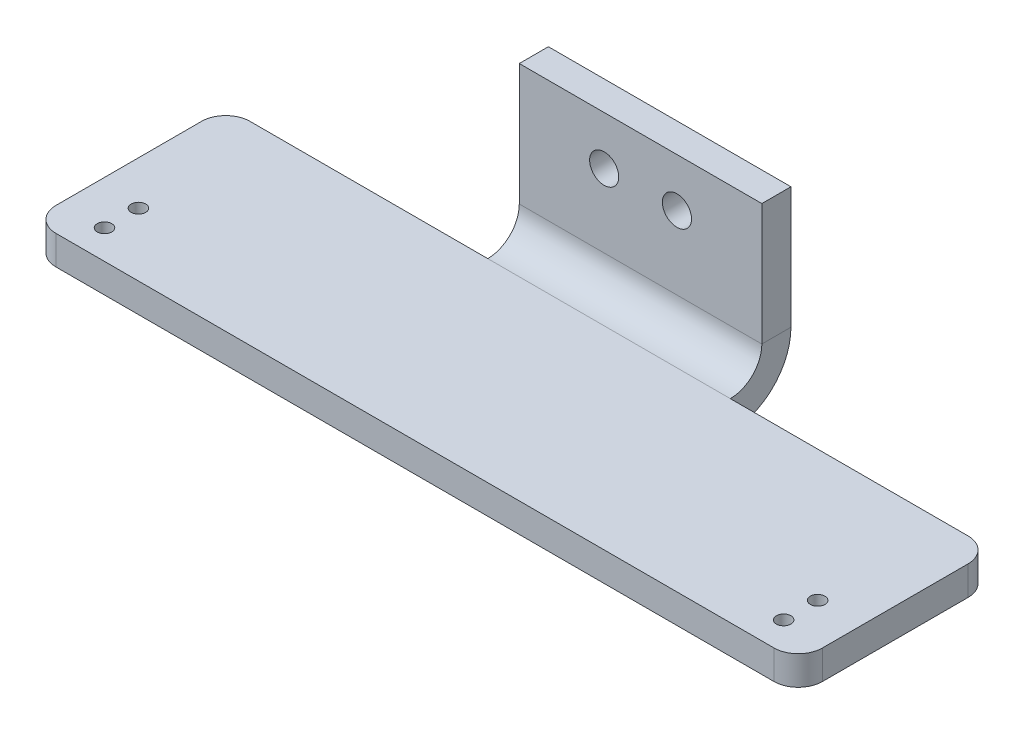
ISO-10303-21;
HEADER;
FILE_DESCRIPTION(('STEP AP214'),'2;1');
FILE_NAME('part.step','',(''),(''),'','','');
FILE_SCHEMA(('AUTOMOTIVE_DESIGN { 1 0 10303 214 1 1 1 1 }'));
ENDSEC;
DATA;
#1=APPLICATION_CONTEXT('core data for automotive mechanical design processes');
#2=APPLICATION_PROTOCOL_DEFINITION('international standard','automotive_design',2000,#1);
#3=PRODUCT_CONTEXT('',#1,'mechanical');
#4=PRODUCT('Part','Part','',(#3));
#5=PRODUCT_RELATED_PRODUCT_CATEGORY('part','',(#4));
#6=PRODUCT_DEFINITION_FORMATION('','',#4);
#7=PRODUCT_DEFINITION_CONTEXT('part definition',#1,'design');
#8=PRODUCT_DEFINITION('design','',#6,#7);
#9=PRODUCT_DEFINITION_SHAPE('','',#8);
#10=(LENGTH_UNIT() NAMED_UNIT(*) SI_UNIT(.MILLI.,.METRE.));
#11=(NAMED_UNIT(*) PLANE_ANGLE_UNIT() SI_UNIT($,.RADIAN.));
#12=(NAMED_UNIT(*) SI_UNIT($,.STERADIAN.) SOLID_ANGLE_UNIT());
#13=UNCERTAINTY_MEASURE_WITH_UNIT(LENGTH_MEASURE(1.E-05),#10,'distance_accuracy_value','');
#14=(GEOMETRIC_REPRESENTATION_CONTEXT(3) GLOBAL_UNCERTAINTY_ASSIGNED_CONTEXT((#13)) GLOBAL_UNIT_ASSIGNED_CONTEXT((#10,
#11,#12)) REPRESENTATION_CONTEXT('',''));
#15=CARTESIAN_POINT('',(0.,0.,0.));
#16=DIRECTION('',(0.,0.,1.));
#17=DIRECTION('',(1.,0.,0.));
#18=AXIS2_PLACEMENT_3D('',#15,#16,#17);
#19=CARTESIAN_POINT('',(0.,-28.4225651045515,-32.5000000000001));
#20=DIRECTION('',(0.,0.,1.));
#21=DIRECTION('',(0.,-1.,0.));
#22=AXIS2_PLACEMENT_3D('',#19,#20,#21);
#23=PLANE('',#22);
#24=CARTESIAN_POINT('',(-7.5,21.5774348954485,-32.5));
#25=DIRECTION('',(0.,0.,1.));
#26=DIRECTION('',(1.,0.,0.));
#27=AXIS2_PLACEMENT_3D('',#24,#25,#26);
#28=CIRCLE('',#27,3.);
#29=CARTESIAN_POINT('',(-4.5,21.5774348954485,-32.5));
#30=VERTEX_POINT('',#29);
#31=EDGE_CURVE('E413',#30,#30,#28,.T.);
#32=ORIENTED_EDGE('',*,*,#31,.T.);
#33=EDGE_LOOP('',(#32));
#34=FACE_BOUND('',#33,.T.);
#35=CARTESIAN_POINT('',(7.5,21.5774348954485,-32.5));
#36=DIRECTION('',(0.,0.,1.));
#37=DIRECTION('',(-1.,0.,0.));
#38=AXIS2_PLACEMENT_3D('',#35,#36,#37);
#39=CIRCLE('',#38,3.);
#40=CARTESIAN_POINT('',(4.5,21.5774348954485,-32.5));
#41=VERTEX_POINT('',#40);
#42=EDGE_CURVE('E417',#41,#41,#39,.T.);
#43=ORIENTED_EDGE('',*,*,#42,.T.);
#44=EDGE_LOOP('',(#43));
#45=FACE_BOUND('',#44,.T.);
#46=DIRECTION('',(0.,1.,0.));
#47=VECTOR('',#46,1.);
#48=CARTESIAN_POINT('',(25.,31.5774348954485,-32.4999999999999));
#49=LINE('',#48,#47);
#50=CARTESIAN_POINT('',(25.,6.50000000000006,-32.5));
#51=VERTEX_POINT('',#50);
#52=CARTESIAN_POINT('',(25.,31.5774348954485,-32.4999999999999));
#53=VERTEX_POINT('',#52);
#54=EDGE_CURVE('E183',#51,#53,#49,.T.);
#55=ORIENTED_EDGE('',*,*,#54,.F.);
#56=DIRECTION('',(-1.,0.,0.));
#57=VECTOR('',#56,1.);
#58=CARTESIAN_POINT('',(0.,6.50000000000004,-32.5));
#59=LINE('',#58,#57);
#60=CARTESIAN_POINT('',(-25.,6.50000000000004,-32.5));
#61=VERTEX_POINT('',#60);
#62=EDGE_CURVE('E157',#51,#61,#59,.T.);
#63=ORIENTED_EDGE('',*,*,#62,.T.);
#64=DIRECTION('',(0.,-1.,0.));
#65=VECTOR('',#64,1.);
#66=CARTESIAN_POINT('',(-25.,31.5774348954485,-32.4999999999999));
#67=LINE('',#66,#65);
#68=CARTESIAN_POINT('',(-25.,31.5774348954485,-32.4999999999999));
#69=VERTEX_POINT('',#68);
#70=EDGE_CURVE('E203',#69,#61,#67,.T.);
#71=ORIENTED_EDGE('',*,*,#70,.F.);
#72=DIRECTION('',(-1.,0.,0.));
#73=VECTOR('',#72,1.);
#74=CARTESIAN_POINT('',(-25.,31.5774348954485,-32.4999999999999));
#75=LINE('',#74,#73);
#76=EDGE_CURVE('E185',#53,#69,#75,.T.);
#77=ORIENTED_EDGE('',*,*,#76,.F.);
#78=EDGE_LOOP('',(#55,#63,#71,#77));
#79=FACE_BOUND('',#78,.T.);
#80=ADVANCED_FACE('F54',(#34,#45,#79),#23,.F.);
#81=CARTESIAN_POINT('',(-25.,31.5774348954485,-32.4999999999999));
#82=DIRECTION('',(-1.,0.,0.));
#83=DIRECTION('',(0.,-1.,0.));
#84=AXIS2_PLACEMENT_3D('',#81,#82,#83);
#85=PLANE('',#84);
#86=DIRECTION('',(0.,0.,-1.));
#87=VECTOR('',#86,1.);
#88=CARTESIAN_POINT('',(-25.,6.50000000000004,-32.5));
#89=LINE('',#88,#87);
#90=CARTESIAN_POINT('',(-25.,6.50000000000003,-26.5));
#91=VERTEX_POINT('',#90);
#92=EDGE_CURVE('E197',#91,#61,#89,.T.);
#93=ORIENTED_EDGE('',*,*,#92,.F.);
#94=DIRECTION('',(0.,-1.,0.));
#95=VECTOR('',#94,1.);
#96=CARTESIAN_POINT('',(-25.,31.5774348954485,-26.4999999999999));
#97=LINE('',#96,#95);
#98=CARTESIAN_POINT('',(-25.,31.5774348954485,-26.4999999999999));
#99=VERTEX_POINT('',#98);
#100=EDGE_CURVE('E189',#99,#91,#97,.T.);
#101=ORIENTED_EDGE('',*,*,#100,.F.);
#102=DIRECTION('',(0.,0.,1.));
#103=VECTOR('',#102,1.);
#104=CARTESIAN_POINT('',(-25.,31.5774348954485,-32.4999999999999));
#105=LINE('',#104,#103);
#106=EDGE_CURVE('E170',#69,#99,#105,.T.);
#107=ORIENTED_EDGE('',*,*,#106,.F.);
#108=ORIENTED_EDGE('',*,*,#70,.T.);
#109=EDGE_LOOP('',(#93,#101,#107,#108));
#110=FACE_BOUND('',#109,.T.);
#111=ADVANCED_FACE('F332',(#110),#85,.T.);
#112=CARTESIAN_POINT('',(-25.,31.5774348954485,-32.4999999999999));
#113=DIRECTION('',(0.,1.,0.));
#114=DIRECTION('',(-1.,0.,0.));
#115=AXIS2_PLACEMENT_3D('',#112,#113,#114);
#116=PLANE('',#115);
#117=DIRECTION('',(-1.,0.,0.));
#118=VECTOR('',#117,1.);
#119=CARTESIAN_POINT('',(-25.,31.5774348954485,-26.4999999999999));
#120=LINE('',#119,#118);
#121=CARTESIAN_POINT('',(25.,31.5774348954485,-26.4999999999999));
#122=VERTEX_POINT('',#121);
#123=EDGE_CURVE('E208',#122,#99,#120,.T.);
#124=ORIENTED_EDGE('',*,*,#123,.F.);
#125=DIRECTION('',(0.,0.,1.));
#126=VECTOR('',#125,1.);
#127=CARTESIAN_POINT('',(25.,31.5774348954485,-32.4999999999999));
#128=LINE('',#127,#126);
#129=EDGE_CURVE('E205',#53,#122,#128,.T.);
#130=ORIENTED_EDGE('',*,*,#129,.F.);
#131=ORIENTED_EDGE('',*,*,#76,.T.);
#132=ORIENTED_EDGE('',*,*,#106,.T.);
#133=EDGE_LOOP('',(#124,#130,#131,#132));
#134=FACE_BOUND('',#133,.T.);
#135=ADVANCED_FACE('F285',(#134),#116,.T.);
#136=CARTESIAN_POINT('',(25.,31.5774348954485,-32.4999999999999));
#137=DIRECTION('',(1.,0.,0.));
#138=DIRECTION('',(0.,1.,0.));
#139=AXIS2_PLACEMENT_3D('',#136,#137,#138);
#140=PLANE('',#139);
#141=DIRECTION('',(0.,0.,1.));
#142=VECTOR('',#141,1.);
#143=CARTESIAN_POINT('',(25.,6.50000000000004,-32.5));
#144=LINE('',#143,#142);
#145=CARTESIAN_POINT('',(25.,6.50000000000003,-26.5));
#146=VERTEX_POINT('',#145);
#147=EDGE_CURVE('E169',#51,#146,#144,.T.);
#148=ORIENTED_EDGE('',*,*,#147,.F.);
#149=ORIENTED_EDGE('',*,*,#54,.T.);
#150=ORIENTED_EDGE('',*,*,#129,.T.);
#151=DIRECTION('',(0.,1.,0.));
#152=VECTOR('',#151,1.);
#153=CARTESIAN_POINT('',(25.,31.5774348954485,-26.4999999999999));
#154=LINE('',#153,#152);
#155=EDGE_CURVE('E193',#146,#122,#154,.T.);
#156=ORIENTED_EDGE('',*,*,#155,.F.);
#157=EDGE_LOOP('',(#148,#149,#150,#156));
#158=FACE_BOUND('',#157,.T.);
#159=ADVANCED_FACE('F192',(#158),#140,.T.);
#160=CARTESIAN_POINT('',(0.,-28.4225651045515,-26.5000000000001));
#161=DIRECTION('',(0.,0.,1.));
#162=DIRECTION('',(0.,-1.,0.));
#163=AXIS2_PLACEMENT_3D('',#160,#161,#162);
#164=PLANE('',#163);
#165=CARTESIAN_POINT('',(-7.5,21.5774348954485,-26.5));
#166=DIRECTION('',(0.,0.,1.));
#167=DIRECTION('',(1.,0.,0.));
#168=AXIS2_PLACEMENT_3D('',#165,#166,#167);
#169=CIRCLE('',#168,3.);
#170=CARTESIAN_POINT('',(-4.5,21.5774348954485,-26.5));
#171=VERTEX_POINT('',#170);
#172=EDGE_CURVE('E416',#171,#171,#169,.T.);
#173=ORIENTED_EDGE('',*,*,#172,.F.);
#174=EDGE_LOOP('',(#173));
#175=FACE_BOUND('',#174,.T.);
#176=CARTESIAN_POINT('',(7.5,21.5774348954485,-26.5));
#177=DIRECTION('',(0.,0.,1.));
#178=DIRECTION('',(-1.,0.,0.));
#179=AXIS2_PLACEMENT_3D('',#176,#177,#178);
#180=CIRCLE('',#179,3.);
#181=CARTESIAN_POINT('',(4.5,21.5774348954485,-26.5));
#182=VERTEX_POINT('',#181);
#183=EDGE_CURVE('E422',#182,#182,#180,.T.);
#184=ORIENTED_EDGE('',*,*,#183,.F.);
#185=EDGE_LOOP('',(#184));
#186=FACE_BOUND('',#185,.T.);
#187=DIRECTION('',(-1.,0.,0.));
#188=VECTOR('',#187,1.);
#189=CARTESIAN_POINT('',(0.,6.50000000000002,-26.5));
#190=LINE('',#189,#188);
#191=EDGE_CURVE('E195',#146,#91,#190,.T.);
#192=ORIENTED_EDGE('',*,*,#191,.F.);
#193=ORIENTED_EDGE('',*,*,#155,.T.);
#194=ORIENTED_EDGE('',*,*,#123,.T.);
#195=ORIENTED_EDGE('',*,*,#100,.T.);
#196=EDGE_LOOP('',(#192,#193,#194,#195));
#197=FACE_BOUND('',#196,.T.);
#198=ADVANCED_FACE('F288',(#175,#186,#197),#164,.T.);
#199=CARTESIAN_POINT('',(-79.,-6.,-20.));
#200=DIRECTION('',(-1.,0.,0.));
#201=DIRECTION('',(0.,0.,1.));
#202=AXIS2_PLACEMENT_3D('',#199,#200,#201);
#203=PLANE('',#202);
#204=DIRECTION('',(0.,0.,1.));
#205=VECTOR('',#204,1.);
#206=CARTESIAN_POINT('',(-79.,-6.,-20.));
#207=LINE('',#206,#205);
#208=CARTESIAN_POINT('',(-79.,-6.,-15.));
#209=VERTEX_POINT('',#208);
#210=CARTESIAN_POINT('',(-79.,-6.,15.));
#211=VERTEX_POINT('',#210);
#212=EDGE_CURVE('E245',#209,#211,#207,.T.);
#213=ORIENTED_EDGE('',*,*,#212,.T.);
#214=DIRECTION('',(0.,1.,0.));
#215=VECTOR('',#214,1.);
#216=CARTESIAN_POINT('',(-79.,-6.,15.));
#217=LINE('',#216,#215);
#218=CARTESIAN_POINT('',(-79.,0.,15.));
#219=VERTEX_POINT('',#218);
#220=EDGE_CURVE('E62',#211,#219,#217,.T.);
#221=ORIENTED_EDGE('',*,*,#220,.T.);
#222=DIRECTION('',(0.,0.,1.));
#223=VECTOR('',#222,1.);
#224=CARTESIAN_POINT('',(-79.,0.,-20.));
#225=LINE('',#224,#223);
#226=CARTESIAN_POINT('',(-79.,0.,-15.));
#227=VERTEX_POINT('',#226);
#228=EDGE_CURVE('E243',#227,#219,#225,.T.);
#229=ORIENTED_EDGE('',*,*,#228,.F.);
#230=DIRECTION('',(0.,1.,0.));
#231=VECTOR('',#230,1.);
#232=CARTESIAN_POINT('',(-79.,-6.,-15.));
#233=LINE('',#232,#231);
#234=EDGE_CURVE('E236',#227,#209,#233,.F.);
#235=ORIENTED_EDGE('',*,*,#234,.T.);
#236=EDGE_LOOP('',(#213,#221,#229,#235));
#237=FACE_BOUND('',#236,.T.);
#238=ADVANCED_FACE('F242',(#237),#203,.T.);
#239=CARTESIAN_POINT('',(-79.,-6.,20.));
#240=DIRECTION('',(0.,0.,1.));
#241=DIRECTION('',(1.,0.,0.));
#242=AXIS2_PLACEMENT_3D('',#239,#240,#241);
#243=PLANE('',#242);
#244=DIRECTION('',(1.,0.,0.));
#245=VECTOR('',#244,1.);
#246=CARTESIAN_POINT('',(-79.,-6.,20.));
#247=LINE('',#246,#245);
#248=CARTESIAN_POINT('',(-74.,-6.,20.));
#249=VERTEX_POINT('',#248);
#250=CARTESIAN_POINT('',(74.,-6.,20.));
#251=VERTEX_POINT('',#250);
#252=EDGE_CURVE('E272',#249,#251,#247,.T.);
#253=ORIENTED_EDGE('',*,*,#252,.T.);
#254=DIRECTION('',(0.,1.,0.));
#255=VECTOR('',#254,1.);
#256=CARTESIAN_POINT('',(74.,-6.,20.));
#257=LINE('',#256,#255);
#258=CARTESIAN_POINT('',(74.,0.,20.));
#259=VERTEX_POINT('',#258);
#260=EDGE_CURVE('E233',#251,#259,#257,.T.);
#261=ORIENTED_EDGE('',*,*,#260,.T.);
#262=DIRECTION('',(1.,0.,0.));
#263=VECTOR('',#262,1.);
#264=CARTESIAN_POINT('',(-79.,0.,20.));
#265=LINE('',#264,#263);
#266=CARTESIAN_POINT('',(-74.,0.,20.));
#267=VERTEX_POINT('',#266);
#268=EDGE_CURVE('E253',#267,#259,#265,.T.);
#269=ORIENTED_EDGE('',*,*,#268,.F.);
#270=DIRECTION('',(0.,1.,0.));
#271=VECTOR('',#270,1.);
#272=CARTESIAN_POINT('',(-74.,-6.,20.));
#273=LINE('',#272,#271);
#274=EDGE_CURVE('E231',#267,#249,#273,.F.);
#275=ORIENTED_EDGE('',*,*,#274,.T.);
#276=EDGE_LOOP('',(#253,#261,#269,#275));
#277=FACE_BOUND('',#276,.T.);
#278=ADVANCED_FACE('F319',(#277),#243,.T.);
#279=CARTESIAN_POINT('',(79.,-6.,-20.));
#280=DIRECTION('',(1.,0.,0.));
#281=DIRECTION('',(0.,0.,-1.));
#282=AXIS2_PLACEMENT_3D('',#279,#280,#281);
#283=PLANE('',#282);
#284=DIRECTION('',(0.,0.,-1.));
#285=VECTOR('',#284,1.);
#286=CARTESIAN_POINT('',(79.,-6.,-20.));
#287=LINE('',#286,#285);
#288=CARTESIAN_POINT('',(79.,-6.,15.));
#289=VERTEX_POINT('',#288);
#290=CARTESIAN_POINT('',(79.,-6.,-15.));
#291=VERTEX_POINT('',#290);
#292=EDGE_CURVE('E269',#289,#291,#287,.T.);
#293=ORIENTED_EDGE('',*,*,#292,.T.);
#294=DIRECTION('',(0.,1.,0.));
#295=VECTOR('',#294,1.);
#296=CARTESIAN_POINT('',(79.,-6.,-15.));
#297=LINE('',#296,#295);
#298=CARTESIAN_POINT('',(79.,0.,-15.));
#299=VERTEX_POINT('',#298);
#300=EDGE_CURVE('E212',#291,#299,#297,.T.);
#301=ORIENTED_EDGE('',*,*,#300,.T.);
#302=DIRECTION('',(0.,0.,-1.));
#303=VECTOR('',#302,1.);
#304=CARTESIAN_POINT('',(79.,0.,-20.));
#305=LINE('',#304,#303);
#306=CARTESIAN_POINT('',(79.,0.,15.));
#307=VERTEX_POINT('',#306);
#308=EDGE_CURVE('E256',#307,#299,#305,.T.);
#309=ORIENTED_EDGE('',*,*,#308,.F.);
#310=DIRECTION('',(0.,1.,0.));
#311=VECTOR('',#310,1.);
#312=CARTESIAN_POINT('',(79.,-6.,15.));
#313=LINE('',#312,#311);
#314=EDGE_CURVE('E202',#307,#289,#313,.F.);
#315=ORIENTED_EDGE('',*,*,#314,.T.);
#316=EDGE_LOOP('',(#293,#301,#309,#315));
#317=FACE_BOUND('',#316,.T.);
#318=ADVANCED_FACE('F309',(#317),#283,.T.);
#319=CARTESIAN_POINT('',(0.,-6.,0.));
#320=DIRECTION('',(0.,1.,0.));
#321=DIRECTION('',(0.,0.,1.));
#322=AXIS2_PLACEMENT_3D('',#319,#320,#321);
#323=PLANE('',#322);
#324=CARTESIAN_POINT('',(70.,-6.,7.));
#325=DIRECTION('',(0.,1.,0.));
#326=DIRECTION('',(0.,0.,-1.));
#327=AXIS2_PLACEMENT_3D('',#324,#325,#326);
#328=CIRCLE('',#327,1.50000000000001);
#329=CARTESIAN_POINT('',(70.,-6.,5.49999999999999));
#330=VERTEX_POINT('',#329);
#331=EDGE_CURVE('E440',#330,#330,#328,.T.);
#332=ORIENTED_EDGE('',*,*,#331,.T.);
#333=EDGE_LOOP('',(#332));
#334=FACE_BOUND('',#333,.T.);
#335=CARTESIAN_POINT('',(70.,-6.,14.));
#336=DIRECTION('',(0.,1.,0.));
#337=DIRECTION('',(0.,0.,-1.));
#338=AXIS2_PLACEMENT_3D('',#335,#336,#337);
#339=CIRCLE('',#338,1.50000000000001);
#340=CARTESIAN_POINT('',(70.,-6.,12.5));
#341=VERTEX_POINT('',#340);
#342=EDGE_CURVE('E434',#341,#341,#339,.T.);
#343=ORIENTED_EDGE('',*,*,#342,.T.);
#344=EDGE_LOOP('',(#343));
#345=FACE_BOUND('',#344,.T.);
#346=CARTESIAN_POINT('',(-70.,-6.,14.));
#347=DIRECTION('',(0.,1.,0.));
#348=DIRECTION('',(0.,0.,1.));
#349=AXIS2_PLACEMENT_3D('',#346,#347,#348);
#350=CIRCLE('',#349,1.5);
#351=CARTESIAN_POINT('',(-70.,-6.,15.5));
#352=VERTEX_POINT('',#351);
#353=EDGE_CURVE('E427',#352,#352,#350,.T.);
#354=ORIENTED_EDGE('',*,*,#353,.T.);
#355=EDGE_LOOP('',(#354));
#356=FACE_BOUND('',#355,.T.);
#357=CARTESIAN_POINT('',(-70.,-6.,7.00000000000002));
#358=DIRECTION('',(0.,1.,0.));
#359=DIRECTION('',(0.,0.,1.));
#360=AXIS2_PLACEMENT_3D('',#357,#358,#359);
#361=CIRCLE('',#360,1.5);
#362=CARTESIAN_POINT('',(-70.,-6.,8.50000000000001));
#363=VERTEX_POINT('',#362);
#364=EDGE_CURVE('E301',#363,#363,#361,.T.);
#365=ORIENTED_EDGE('',*,*,#364,.T.);
#366=EDGE_LOOP('',(#365));
#367=FACE_BOUND('',#366,.T.);
#368=DIRECTION('',(-1.,0.,0.));
#369=VECTOR('',#368,1.);
#370=CARTESIAN_POINT('',(25.,-6.,-20.));
#371=LINE('',#370,#369);
#372=CARTESIAN_POINT('',(74.,-6.,-20.));
#373=VERTEX_POINT('',#372);
#374=CARTESIAN_POINT('',(25.,-6.,-20.));
#375=VERTEX_POINT('',#374);
#376=EDGE_CURVE('E267',#373,#375,#371,.T.);
#377=ORIENTED_EDGE('',*,*,#376,.F.);
#378=CARTESIAN_POINT('',(74.,-6.,-15.));
#379=DIRECTION('',(0.,1.,0.));
#380=DIRECTION('',(0.,0.,1.));
#381=AXIS2_PLACEMENT_3D('',#378,#379,#380);
#382=CIRCLE('',#381,5.);
#383=EDGE_CURVE('E229',#373,#291,#382,.F.);
#384=ORIENTED_EDGE('',*,*,#383,.T.);
#385=ORIENTED_EDGE('',*,*,#292,.F.);
#386=CARTESIAN_POINT('',(74.,-6.,15.));
#387=DIRECTION('',(0.,1.,0.));
#388=DIRECTION('',(0.,0.,1.));
#389=AXIS2_PLACEMENT_3D('',#386,#387,#388);
#390=CIRCLE('',#389,5.);
#391=EDGE_CURVE('E227',#289,#251,#390,.F.);
#392=ORIENTED_EDGE('',*,*,#391,.T.);
#393=ORIENTED_EDGE('',*,*,#252,.F.);
#394=CARTESIAN_POINT('',(-74.,-6.,15.));
#395=DIRECTION('',(0.,1.,0.));
#396=DIRECTION('',(0.,0.,1.));
#397=AXIS2_PLACEMENT_3D('',#394,#395,#396);
#398=CIRCLE('',#397,5.);
#399=EDGE_CURVE('E75',#249,#211,#398,.F.);
#400=ORIENTED_EDGE('',*,*,#399,.T.);
#401=ORIENTED_EDGE('',*,*,#212,.F.);
#402=CARTESIAN_POINT('',(-74.,-6.,-15.));
#403=DIRECTION('',(0.,1.,0.));
#404=DIRECTION('',(0.,0.,1.));
#405=AXIS2_PLACEMENT_3D('',#402,#403,#404);
#406=CIRCLE('',#405,5.);
#407=CARTESIAN_POINT('',(-74.,-6.,-20.));
#408=VERTEX_POINT('',#407);
#409=EDGE_CURVE('E69',#209,#408,#406,.F.);
#410=ORIENTED_EDGE('',*,*,#409,.T.);
#411=DIRECTION('',(-1.,0.,0.));
#412=VECTOR('',#411,1.);
#413=CARTESIAN_POINT('',(-79.,-6.,-20.));
#414=LINE('',#413,#412);
#415=CARTESIAN_POINT('',(-25.,-6.,-20.));
#416=VERTEX_POINT('',#415);
#417=EDGE_CURVE('E209',#416,#408,#414,.T.);
#418=ORIENTED_EDGE('',*,*,#417,.F.);
#419=DIRECTION('',(-1.,0.,0.));
#420=VECTOR('',#419,1.);
#421=CARTESIAN_POINT('',(0.,-6.,-20.));
#422=LINE('',#421,#420);
#423=EDGE_CURVE('E278',#375,#416,#422,.T.);
#424=ORIENTED_EDGE('',*,*,#423,.F.);
#425=EDGE_LOOP('',(#377,#384,#385,#392,#393,#400,#401,#410,#418,#424));
#426=FACE_BOUND('',#425,.T.);
#427=ADVANCED_FACE('F317',(#334,#345,#356,#367,#426),#323,.F.);
#428=CARTESIAN_POINT('',(25.,-6.,-20.));
#429=DIRECTION('',(0.,0.,-1.));
#430=DIRECTION('',(-1.,0.,0.));
#431=AXIS2_PLACEMENT_3D('',#428,#429,#430);
#432=PLANE('',#431);
#433=DIRECTION('',(-1.,0.,0.));
#434=VECTOR('',#433,1.);
#435=CARTESIAN_POINT('',(25.,0.,-20.));
#436=LINE('',#435,#434);
#437=CARTESIAN_POINT('',(74.,0.,-20.));
#438=VERTEX_POINT('',#437);
#439=CARTESIAN_POINT('',(25.,0.,-20.));
#440=VERTEX_POINT('',#439);
#441=EDGE_CURVE('E264',#438,#440,#436,.T.);
#442=ORIENTED_EDGE('',*,*,#441,.F.);
#443=DIRECTION('',(0.,1.,0.));
#444=VECTOR('',#443,1.);
#445=CARTESIAN_POINT('',(74.,-6.,-20.));
#446=LINE('',#445,#444);
#447=EDGE_CURVE('E223',#438,#373,#446,.F.);
#448=ORIENTED_EDGE('',*,*,#447,.T.);
#449=ORIENTED_EDGE('',*,*,#376,.T.);
#450=DIRECTION('',(0.,1.,0.));
#451=VECTOR('',#450,1.);
#452=CARTESIAN_POINT('',(25.,-6.,-20.));
#453=LINE('',#452,#451);
#454=EDGE_CURVE('E179',#375,#440,#453,.T.);
#455=ORIENTED_EDGE('',*,*,#454,.T.);
#456=EDGE_LOOP('',(#442,#448,#449,#455));
#457=FACE_BOUND('',#456,.T.);
#458=ADVANCED_FACE('F362',(#457),#432,.T.);
#459=CARTESIAN_POINT('',(0.,0.,0.));
#460=DIRECTION('',(0.,1.,0.));
#461=DIRECTION('',(0.,0.,1.));
#462=AXIS2_PLACEMENT_3D('',#459,#460,#461);
#463=PLANE('',#462);
#464=CARTESIAN_POINT('',(70.,0.,7.));
#465=DIRECTION('',(0.,1.,0.));
#466=DIRECTION('',(0.,0.,-1.));
#467=AXIS2_PLACEMENT_3D('',#464,#465,#466);
#468=CIRCLE('',#467,1.50000000000001);
#469=CARTESIAN_POINT('',(70.,0.,5.49999999999999));
#470=VERTEX_POINT('',#469);
#471=EDGE_CURVE('E419',#470,#470,#468,.T.);
#472=ORIENTED_EDGE('',*,*,#471,.F.);
#473=EDGE_LOOP('',(#472));
#474=FACE_BOUND('',#473,.T.);
#475=CARTESIAN_POINT('',(70.,0.,14.));
#476=DIRECTION('',(0.,1.,0.));
#477=DIRECTION('',(0.,0.,-1.));
#478=AXIS2_PLACEMENT_3D('',#475,#476,#477);
#479=CIRCLE('',#478,1.50000000000001);
#480=CARTESIAN_POINT('',(70.,0.,12.5));
#481=VERTEX_POINT('',#480);
#482=EDGE_CURVE('E437',#481,#481,#479,.T.);
#483=ORIENTED_EDGE('',*,*,#482,.F.);
#484=EDGE_LOOP('',(#483));
#485=FACE_BOUND('',#484,.T.);
#486=CARTESIAN_POINT('',(-70.,0.,14.));
#487=DIRECTION('',(0.,1.,0.));
#488=DIRECTION('',(0.,0.,1.));
#489=AXIS2_PLACEMENT_3D('',#486,#487,#488);
#490=CIRCLE('',#489,1.5);
#491=CARTESIAN_POINT('',(-70.,0.,15.5));
#492=VERTEX_POINT('',#491);
#493=EDGE_CURVE('E431',#492,#492,#490,.T.);
#494=ORIENTED_EDGE('',*,*,#493,.F.);
#495=EDGE_LOOP('',(#494));
#496=FACE_BOUND('',#495,.T.);
#497=CARTESIAN_POINT('',(-70.,0.,7.00000000000002));
#498=DIRECTION('',(0.,1.,0.));
#499=DIRECTION('',(0.,0.,1.));
#500=AXIS2_PLACEMENT_3D('',#497,#498,#499);
#501=CIRCLE('',#500,1.5);
#502=CARTESIAN_POINT('',(-70.,0.,8.50000000000001));
#503=VERTEX_POINT('',#502);
#504=EDGE_CURVE('E430',#503,#503,#501,.T.);
#505=ORIENTED_EDGE('',*,*,#504,.F.);
#506=EDGE_LOOP('',(#505));
#507=FACE_BOUND('',#506,.T.);
#508=ORIENTED_EDGE('',*,*,#308,.T.);
#509=CARTESIAN_POINT('',(74.,0.,-15.));
#510=DIRECTION('',(0.,1.,0.));
#511=DIRECTION('',(0.,0.,1.));
#512=AXIS2_PLACEMENT_3D('',#509,#510,#511);
#513=CIRCLE('',#512,5.);
#514=EDGE_CURVE('E221',#299,#438,#513,.T.);
#515=ORIENTED_EDGE('',*,*,#514,.T.);
#516=ORIENTED_EDGE('',*,*,#441,.T.);
#517=DIRECTION('',(-1.,0.,0.));
#518=VECTOR('',#517,1.);
#519=CARTESIAN_POINT('',(0.,0.,-20.));
#520=LINE('',#519,#518);
#521=CARTESIAN_POINT('',(-25.,0.,-20.));
#522=VERTEX_POINT('',#521);
#523=EDGE_CURVE('E258',#440,#522,#520,.T.);
#524=ORIENTED_EDGE('',*,*,#523,.T.);
#525=DIRECTION('',(-1.,0.,0.));
#526=VECTOR('',#525,1.);
#527=CARTESIAN_POINT('',(-79.,0.,-20.));
#528=LINE('',#527,#526);
#529=CARTESIAN_POINT('',(-74.,0.,-20.));
#530=VERTEX_POINT('',#529);
#531=EDGE_CURVE('E254',#522,#530,#528,.T.);
#532=ORIENTED_EDGE('',*,*,#531,.T.);
#533=CARTESIAN_POINT('',(-74.,0.,-15.));
#534=DIRECTION('',(0.,1.,0.));
#535=DIRECTION('',(0.,0.,1.));
#536=AXIS2_PLACEMENT_3D('',#533,#534,#535);
#537=CIRCLE('',#536,5.);
#538=EDGE_CURVE('E215',#530,#227,#537,.T.);
#539=ORIENTED_EDGE('',*,*,#538,.T.);
#540=ORIENTED_EDGE('',*,*,#228,.T.);
#541=CARTESIAN_POINT('',(-74.,0.,15.));
#542=DIRECTION('',(0.,1.,0.));
#543=DIRECTION('',(0.,0.,1.));
#544=AXIS2_PLACEMENT_3D('',#541,#542,#543);
#545=CIRCLE('',#544,5.);
#546=EDGE_CURVE('E217',#219,#267,#545,.T.);
#547=ORIENTED_EDGE('',*,*,#546,.T.);
#548=ORIENTED_EDGE('',*,*,#268,.T.);
#549=CARTESIAN_POINT('',(74.,0.,15.));
#550=DIRECTION('',(0.,1.,0.));
#551=DIRECTION('',(0.,0.,1.));
#552=AXIS2_PLACEMENT_3D('',#549,#550,#551);
#553=CIRCLE('',#552,5.);
#554=EDGE_CURVE('E219',#259,#307,#553,.T.);
#555=ORIENTED_EDGE('',*,*,#554,.T.);
#556=EDGE_LOOP('',(#508,#515,#516,#524,#532,#539,#540,#547,#548,#555));
#557=FACE_BOUND('',#556,.T.);
#558=ADVANCED_FACE('F249',(#474,#485,#496,#507,#557),#463,.T.);
#559=CARTESIAN_POINT('',(-79.,-6.,-20.));
#560=DIRECTION('',(0.,0.,-1.));
#561=DIRECTION('',(-1.,0.,0.));
#562=AXIS2_PLACEMENT_3D('',#559,#560,#561);
#563=PLANE('',#562);
#564=ORIENTED_EDGE('',*,*,#417,.T.);
#565=DIRECTION('',(0.,1.,0.));
#566=VECTOR('',#565,1.);
#567=CARTESIAN_POINT('',(-74.,-6.,-20.));
#568=LINE('',#567,#566);
#569=EDGE_CURVE('E14',#408,#530,#568,.T.);
#570=ORIENTED_EDGE('',*,*,#569,.T.);
#571=ORIENTED_EDGE('',*,*,#531,.F.);
#572=DIRECTION('',(0.,1.,0.));
#573=VECTOR('',#572,1.);
#574=CARTESIAN_POINT('',(-25.,-6.,-20.));
#575=LINE('',#574,#573);
#576=EDGE_CURVE('E276',#416,#522,#575,.T.);
#577=ORIENTED_EDGE('',*,*,#576,.F.);
#578=EDGE_LOOP('',(#564,#570,#571,#577));
#579=FACE_BOUND('',#578,.T.);
#580=ADVANCED_FACE('F364',(#579),#563,.T.);
#581=CARTESIAN_POINT('',(25.,6.5,-20.));
#582=DIRECTION('',(1.,0.,0.));
#583=DIRECTION('',(0.,0.,-1.));
#584=AXIS2_PLACEMENT_3D('',#581,#582,#583);
#585=PLANE('',#584);
#586=ORIENTED_EDGE('',*,*,#147,.T.);
#587=CARTESIAN_POINT('',(25.,6.5,-20.));
#588=DIRECTION('',(1.,0.,0.));
#589=DIRECTION('',(0.,0.,-1.));
#590=AXIS2_PLACEMENT_3D('',#587,#588,#589);
#591=CIRCLE('',#590,6.5);
#592=EDGE_CURVE('E296',#146,#440,#591,.F.);
#593=ORIENTED_EDGE('',*,*,#592,.T.);
#594=ORIENTED_EDGE('',*,*,#454,.F.);
#595=CARTESIAN_POINT('',(25.,6.5,-20.));
#596=DIRECTION('',(-1.,0.,0.));
#597=DIRECTION('',(0.,0.,-1.));
#598=AXIS2_PLACEMENT_3D('',#595,#596,#597);
#599=CIRCLE('',#598,12.5);
#600=EDGE_CURVE('E160',#51,#375,#599,.T.);
#601=ORIENTED_EDGE('',*,*,#600,.F.);
#602=EDGE_LOOP('',(#586,#593,#594,#601));
#603=FACE_BOUND('',#602,.T.);
#604=ADVANCED_FACE('F174',(#603),#585,.T.);
#605=CARTESIAN_POINT('',(-25.,6.5,-20.));
#606=DIRECTION('',(-1.,0.,0.));
#607=DIRECTION('',(0.,0.,1.));
#608=AXIS2_PLACEMENT_3D('',#605,#606,#607);
#609=PLANE('',#608);
#610=CARTESIAN_POINT('',(-25.,6.5,-20.));
#611=DIRECTION('',(1.,0.,0.));
#612=DIRECTION('',(0.,0.,-1.));
#613=AXIS2_PLACEMENT_3D('',#610,#611,#612);
#614=CIRCLE('',#613,6.5);
#615=EDGE_CURVE('E180',#522,#91,#614,.T.);
#616=ORIENTED_EDGE('',*,*,#615,.T.);
#617=ORIENTED_EDGE('',*,*,#92,.T.);
#618=CARTESIAN_POINT('',(-25.,6.5,-20.));
#619=DIRECTION('',(1.,0.,0.));
#620=DIRECTION('',(0.,0.,1.));
#621=AXIS2_PLACEMENT_3D('',#618,#619,#620);
#622=CIRCLE('',#621,12.5);
#623=EDGE_CURVE('E163',#416,#61,#622,.T.);
#624=ORIENTED_EDGE('',*,*,#623,.F.);
#625=ORIENTED_EDGE('',*,*,#576,.T.);
#626=EDGE_LOOP('',(#616,#617,#624,#625));
#627=FACE_BOUND('',#626,.T.);
#628=ADVANCED_FACE('F298',(#627),#609,.T.);
#629=CARTESIAN_POINT('',(-52.5231658347017,6.5,-20.));
#630=DIRECTION('',(1.,0.,0.));
#631=DIRECTION('',(0.,0.,-1.));
#632=AXIS2_PLACEMENT_3D('',#629,#630,#631);
#633=CYLINDRICAL_SURFACE('',#632,12.5);
#634=ORIENTED_EDGE('',*,*,#423,.T.);
#635=ORIENTED_EDGE('',*,*,#623,.T.);
#636=ORIENTED_EDGE('',*,*,#62,.F.);
#637=ORIENTED_EDGE('',*,*,#600,.T.);
#638=EDGE_LOOP('',(#634,#635,#636,#637));
#639=FACE_BOUND('',#638,.T.);
#640=ADVANCED_FACE('F159',(#639),#633,.T.);
#641=CARTESIAN_POINT('',(-52.5231658347017,6.5,-20.));
#642=DIRECTION('',(1.,0.,0.));
#643=DIRECTION('',(0.,0.,-1.));
#644=AXIS2_PLACEMENT_3D('',#641,#642,#643);
#645=CYLINDRICAL_SURFACE('',#644,6.5);
#646=ORIENTED_EDGE('',*,*,#523,.F.);
#647=ORIENTED_EDGE('',*,*,#592,.F.);
#648=ORIENTED_EDGE('',*,*,#191,.T.);
#649=ORIENTED_EDGE('',*,*,#615,.F.);
#650=EDGE_LOOP('',(#646,#647,#648,#649));
#651=FACE_BOUND('',#650,.T.);
#652=ADVANCED_FACE('F294',(#651),#645,.F.);
#653=CARTESIAN_POINT('',(-70.,-6.,7.00000000000002));
#654=DIRECTION('',(0.,1.,0.));
#655=DIRECTION('',(0.,0.,1.));
#656=AXIS2_PLACEMENT_3D('',#653,#654,#655);
#657=CYLINDRICAL_SURFACE('',#656,1.5);
#658=ORIENTED_EDGE('',*,*,#364,.F.);
#659=EDGE_LOOP('',(#658));
#660=FACE_BOUND('',#659,.T.);
#661=ORIENTED_EDGE('',*,*,#504,.T.);
#662=EDGE_LOOP('',(#661));
#663=FACE_BOUND('',#662,.T.);
#664=ADVANCED_FACE('F390',(#660,#663),#657,.F.);
#665=CARTESIAN_POINT('',(-70.,-6.,14.));
#666=DIRECTION('',(0.,1.,0.));
#667=DIRECTION('',(0.,0.,1.));
#668=AXIS2_PLACEMENT_3D('',#665,#666,#667);
#669=CYLINDRICAL_SURFACE('',#668,1.5);
#670=ORIENTED_EDGE('',*,*,#353,.F.);
#671=EDGE_LOOP('',(#670));
#672=FACE_BOUND('',#671,.T.);
#673=ORIENTED_EDGE('',*,*,#493,.T.);
#674=EDGE_LOOP('',(#673));
#675=FACE_BOUND('',#674,.T.);
#676=ADVANCED_FACE('F394',(#672,#675),#669,.F.);
#677=CARTESIAN_POINT('',(70.,-6.,14.));
#678=DIRECTION('',(0.,1.,0.));
#679=DIRECTION('',(0.,0.,1.));
#680=AXIS2_PLACEMENT_3D('',#677,#678,#679);
#681=CYLINDRICAL_SURFACE('',#680,1.50000000000001);
#682=ORIENTED_EDGE('',*,*,#342,.F.);
#683=EDGE_LOOP('',(#682));
#684=FACE_BOUND('',#683,.T.);
#685=ORIENTED_EDGE('',*,*,#482,.T.);
#686=EDGE_LOOP('',(#685));
#687=FACE_BOUND('',#686,.T.);
#688=ADVANCED_FACE('F356',(#684,#687),#681,.F.);
#689=CARTESIAN_POINT('',(70.,-6.,7.));
#690=DIRECTION('',(0.,1.,0.));
#691=DIRECTION('',(0.,0.,1.));
#692=AXIS2_PLACEMENT_3D('',#689,#690,#691);
#693=CYLINDRICAL_SURFACE('',#692,1.50000000000001);
#694=ORIENTED_EDGE('',*,*,#331,.F.);
#695=EDGE_LOOP('',(#694));
#696=FACE_BOUND('',#695,.T.);
#697=ORIENTED_EDGE('',*,*,#471,.T.);
#698=EDGE_LOOP('',(#697));
#699=FACE_BOUND('',#698,.T.);
#700=ADVANCED_FACE('F351',(#696,#699),#693,.F.);
#701=CARTESIAN_POINT('',(74.,-6.,-15.));
#702=DIRECTION('',(0.,1.,0.));
#703=DIRECTION('',(0.,0.,1.));
#704=AXIS2_PLACEMENT_3D('',#701,#702,#703);
#705=CYLINDRICAL_SURFACE('',#704,5.);
#706=ORIENTED_EDGE('',*,*,#383,.F.);
#707=ORIENTED_EDGE('',*,*,#447,.F.);
#708=ORIENTED_EDGE('',*,*,#514,.F.);
#709=ORIENTED_EDGE('',*,*,#300,.F.);
#710=EDGE_LOOP('',(#706,#707,#708,#709));
#711=FACE_BOUND('',#710,.T.);
#712=ADVANCED_FACE('F329',(#711),#705,.T.);
#713=CARTESIAN_POINT('',(74.,-6.,15.));
#714=DIRECTION('',(0.,1.,0.));
#715=DIRECTION('',(0.,0.,1.));
#716=AXIS2_PLACEMENT_3D('',#713,#714,#715);
#717=CYLINDRICAL_SURFACE('',#716,5.);
#718=ORIENTED_EDGE('',*,*,#391,.F.);
#719=ORIENTED_EDGE('',*,*,#314,.F.);
#720=ORIENTED_EDGE('',*,*,#554,.F.);
#721=ORIENTED_EDGE('',*,*,#260,.F.);
#722=EDGE_LOOP('',(#718,#719,#720,#721));
#723=FACE_BOUND('',#722,.T.);
#724=ADVANCED_FACE('F314',(#723),#717,.T.);
#725=CARTESIAN_POINT('',(-74.,-6.,15.));
#726=DIRECTION('',(0.,1.,0.));
#727=DIRECTION('',(0.,0.,1.));
#728=AXIS2_PLACEMENT_3D('',#725,#726,#727);
#729=CYLINDRICAL_SURFACE('',#728,5.);
#730=ORIENTED_EDGE('',*,*,#399,.F.);
#731=ORIENTED_EDGE('',*,*,#274,.F.);
#732=ORIENTED_EDGE('',*,*,#546,.F.);
#733=ORIENTED_EDGE('',*,*,#220,.F.);
#734=EDGE_LOOP('',(#730,#731,#732,#733));
#735=FACE_BOUND('',#734,.T.);
#736=ADVANCED_FACE('F321',(#735),#729,.T.);
#737=CARTESIAN_POINT('',(-74.,-6.,-15.));
#738=DIRECTION('',(0.,1.,0.));
#739=DIRECTION('',(0.,0.,1.));
#740=AXIS2_PLACEMENT_3D('',#737,#738,#739);
#741=CYLINDRICAL_SURFACE('',#740,5.);
#742=ORIENTED_EDGE('',*,*,#409,.F.);
#743=ORIENTED_EDGE('',*,*,#234,.F.);
#744=ORIENTED_EDGE('',*,*,#538,.F.);
#745=ORIENTED_EDGE('',*,*,#569,.F.);
#746=EDGE_LOOP('',(#742,#743,#744,#745));
#747=FACE_BOUND('',#746,.T.);
#748=ADVANCED_FACE('F56',(#747),#741,.T.);
#749=CARTESIAN_POINT('',(7.5,21.5774348954485,-32.5));
#750=DIRECTION('',(0.,0.,1.));
#751=DIRECTION('',(1.,0.,0.));
#752=AXIS2_PLACEMENT_3D('',#749,#750,#751);
#753=CYLINDRICAL_SURFACE('',#752,3.);
#754=ORIENTED_EDGE('',*,*,#42,.F.);
#755=EDGE_LOOP('',(#754));
#756=FACE_BOUND('',#755,.T.);
#757=ORIENTED_EDGE('',*,*,#183,.T.);
#758=EDGE_LOOP('',(#757));
#759=FACE_BOUND('',#758,.T.);
#760=ADVANCED_FACE('F327',(#756,#759),#753,.F.);
#761=CARTESIAN_POINT('',(-7.5,21.5774348954485,-32.5));
#762=DIRECTION('',(0.,0.,1.));
#763=DIRECTION('',(1.,0.,0.));
#764=AXIS2_PLACEMENT_3D('',#761,#762,#763);
#765=CYLINDRICAL_SURFACE('',#764,3.);
#766=ORIENTED_EDGE('',*,*,#31,.F.);
#767=EDGE_LOOP('',(#766));
#768=FACE_BOUND('',#767,.T.);
#769=ORIENTED_EDGE('',*,*,#172,.T.);
#770=EDGE_LOOP('',(#769));
#771=FACE_BOUND('',#770,.T.);
#772=ADVANCED_FACE('F405',(#768,#771),#765,.F.);
#773=CLOSED_SHELL('',(#80,#111,#135,#159,#198,#238,#278,#318,#427,#458,#558,#580,#604,#628,#640,
#652,#664,#676,#688,#700,#712,#724,#736,#748,#760,#772));
#774=MANIFOLD_SOLID_BREP('B2',#773);
#775=ADVANCED_BREP_SHAPE_REPRESENTATION('',(#18,#774),#14);
#776=SHAPE_DEFINITION_REPRESENTATION(#9,#775);
ENDSEC;
END-ISO-10303-21;
